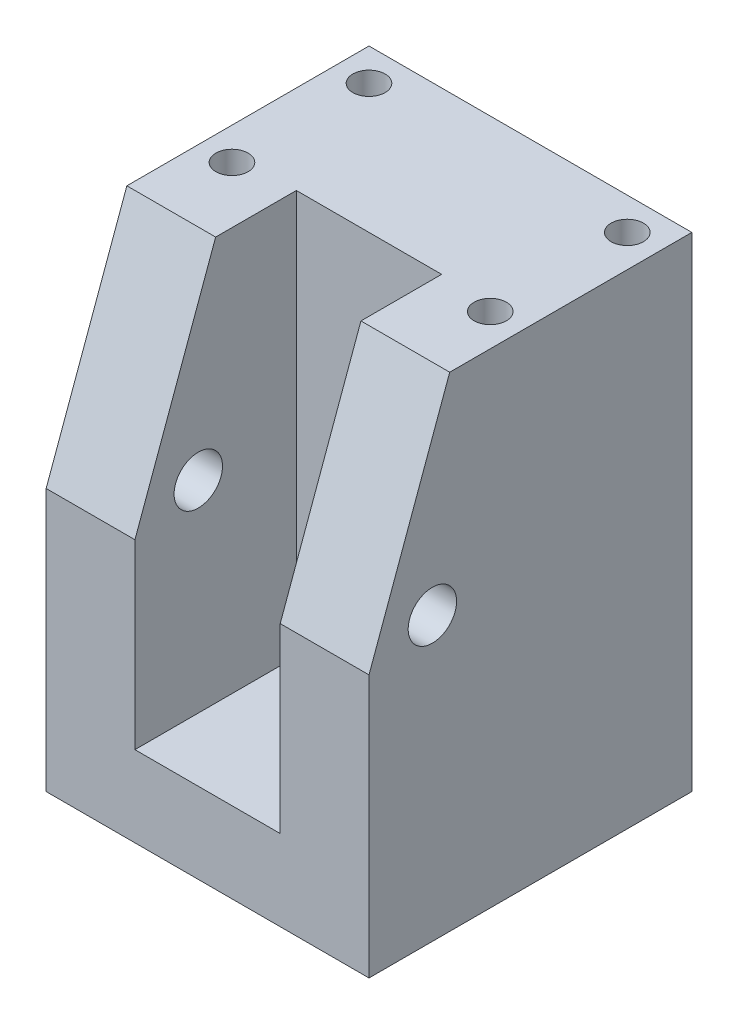
ISO-10303-21;
HEADER;
FILE_DESCRIPTION(('STEP AP214'),'2;1');
FILE_NAME('part.step','',(''),(''),'','','');
FILE_SCHEMA(('AUTOMOTIVE_DESIGN { 1 0 10303 214 1 1 1 1 }'));
ENDSEC;
DATA;
#1=APPLICATION_CONTEXT('core data for automotive mechanical design processes');
#2=APPLICATION_PROTOCOL_DEFINITION('international standard','automotive_design',2000,#1);
#3=PRODUCT_CONTEXT('',#1,'mechanical');
#4=PRODUCT('Part','Part','',(#3));
#5=PRODUCT_RELATED_PRODUCT_CATEGORY('part','',(#4));
#6=PRODUCT_DEFINITION_FORMATION('','',#4);
#7=PRODUCT_DEFINITION_CONTEXT('part definition',#1,'design');
#8=PRODUCT_DEFINITION('design','',#6,#7);
#9=PRODUCT_DEFINITION_SHAPE('','',#8);
#10=(LENGTH_UNIT() NAMED_UNIT(*) SI_UNIT(.MILLI.,.METRE.));
#11=(NAMED_UNIT(*) PLANE_ANGLE_UNIT() SI_UNIT($,.RADIAN.));
#12=(NAMED_UNIT(*) SI_UNIT($,.STERADIAN.) SOLID_ANGLE_UNIT());
#13=UNCERTAINTY_MEASURE_WITH_UNIT(LENGTH_MEASURE(1.E-05),#10,'distance_accuracy_value','');
#14=(GEOMETRIC_REPRESENTATION_CONTEXT(3) GLOBAL_UNCERTAINTY_ASSIGNED_CONTEXT((#13)) GLOBAL_UNIT_ASSIGNED_CONTEXT((#10,
#11,#12)) REPRESENTATION_CONTEXT('',''));
#15=CARTESIAN_POINT('',(0.,0.,0.));
#16=DIRECTION('',(0.,0.,1.));
#17=DIRECTION('',(1.,0.,0.));
#18=AXIS2_PLACEMENT_3D('',#15,#16,#17);
#19=CARTESIAN_POINT('',(0.,-60.,20.));
#20=DIRECTION('',(0.,0.,-1.));
#21=DIRECTION('',(-1.,0.,0.));
#22=AXIS2_PLACEMENT_3D('',#19,#20,#21);
#23=PLANE('',#22);
#24=DIRECTION('',(0.,1.,0.));
#25=VECTOR('',#24,1.);
#26=CARTESIAN_POINT('',(20.,-60.,20.));
#27=LINE('',#26,#25);
#28=CARTESIAN_POINT('',(20.,-60.,20.));
#29=VERTEX_POINT('',#28);
#30=CARTESIAN_POINT('',(20.,-27.4747741945462,20.));
#31=VERTEX_POINT('',#30);
#32=EDGE_CURVE('E174',#29,#31,#27,.T.);
#33=ORIENTED_EDGE('',*,*,#32,.T.);
#34=DIRECTION('',(-1.,0.,0.));
#35=VECTOR('',#34,1.);
#36=CARTESIAN_POINT('',(9.,-27.4747741945462,20.));
#37=LINE('',#36,#35);
#38=CARTESIAN_POINT('',(9.,-27.4747741945462,20.));
#39=VERTEX_POINT('',#38);
#40=EDGE_CURVE('E212',#31,#39,#37,.T.);
#41=ORIENTED_EDGE('',*,*,#40,.T.);
#42=DIRECTION('',(0.,1.,0.));
#43=VECTOR('',#42,1.);
#44=CARTESIAN_POINT('',(9.,-50.,20.));
#45=LINE('',#44,#43);
#46=CARTESIAN_POINT('',(9.,-50.,20.));
#47=VERTEX_POINT('',#46);
#48=EDGE_CURVE('E157',#47,#39,#45,.T.);
#49=ORIENTED_EDGE('',*,*,#48,.F.);
#50=DIRECTION('',(-1.,0.,0.));
#51=VECTOR('',#50,1.);
#52=CARTESIAN_POINT('',(0.,-50.,20.));
#53=LINE('',#52,#51);
#54=CARTESIAN_POINT('',(-9.,-50.,20.));
#55=VERTEX_POINT('',#54);
#56=EDGE_CURVE('E132',#47,#55,#53,.T.);
#57=ORIENTED_EDGE('',*,*,#56,.T.);
#58=DIRECTION('',(0.,1.,0.));
#59=VECTOR('',#58,1.);
#60=CARTESIAN_POINT('',(-9.,-50.,20.));
#61=LINE('',#60,#59);
#62=CARTESIAN_POINT('',(-9.,-27.4747741945462,20.));
#63=VERTEX_POINT('',#62);
#64=EDGE_CURVE('E160',#55,#63,#61,.T.);
#65=ORIENTED_EDGE('',*,*,#64,.T.);
#66=DIRECTION('',(-1.,0.,0.));
#67=VECTOR('',#66,1.);
#68=CARTESIAN_POINT('',(-20.,-27.4747741945462,20.));
#69=LINE('',#68,#67);
#70=CARTESIAN_POINT('',(-20.,-27.4747741945462,20.));
#71=VERTEX_POINT('',#70);
#72=EDGE_CURVE('E182',#63,#71,#69,.T.);
#73=ORIENTED_EDGE('',*,*,#72,.T.);
#74=DIRECTION('',(0.,1.,0.));
#75=VECTOR('',#74,1.);
#76=CARTESIAN_POINT('',(-20.,-60.,20.));
#77=LINE('',#76,#75);
#78=CARTESIAN_POINT('',(-20.,-60.,20.));
#79=VERTEX_POINT('',#78);
#80=EDGE_CURVE('E180',#79,#71,#77,.T.);
#81=ORIENTED_EDGE('',*,*,#80,.F.);
#82=DIRECTION('',(-1.,0.,0.));
#83=VECTOR('',#82,1.);
#84=CARTESIAN_POINT('',(0.,-60.,20.));
#85=LINE('',#84,#83);
#86=EDGE_CURVE('E164',#29,#79,#85,.T.);
#87=ORIENTED_EDGE('',*,*,#86,.F.);
#88=EDGE_LOOP('',(#33,#41,#49,#57,#65,#73,#81,#87));
#89=FACE_BOUND('',#88,.T.);
#90=ADVANCED_FACE('F42',(#89),#23,.F.);
#91=CARTESIAN_POINT('',(-20.,-60.,0.));
#92=DIRECTION('',(-1.,0.,0.));
#93=DIRECTION('',(0.,0.,1.));
#94=AXIS2_PLACEMENT_3D('',#91,#92,#93);
#95=PLANE('',#94);
#96=CARTESIAN_POINT('',(-20.,-25.,12.1487261445352));
#97=DIRECTION('',(-1.,0.,0.));
#98=DIRECTION('',(0.,0.,1.));
#99=AXIS2_PLACEMENT_3D('',#96,#97,#98);
#100=CIRCLE('',#99,3.);
#101=CARTESIAN_POINT('',(-20.,-25.,15.1487261445352));
#102=VERTEX_POINT('',#101);
#103=EDGE_CURVE('E194',#102,#102,#100,.F.);
#104=ORIENTED_EDGE('',*,*,#103,.T.);
#105=EDGE_LOOP('',(#104));
#106=FACE_BOUND('',#105,.T.);
#107=ORIENTED_EDGE('',*,*,#80,.T.);
#108=DIRECTION('',(0.,0.939692620785908,-0.342020143325669));
#109=VECTOR('',#108,1.);
#110=CARTESIAN_POINT('',(-20.,-49.7673952451366,28.1138505061911));
#111=LINE('',#110,#109);
#112=CARTESIAN_POINT('',(-20.,0.,9.99999999999999));
#113=VERTEX_POINT('',#112);
#114=EDGE_CURVE('E51',#71,#113,#111,.T.);
#115=ORIENTED_EDGE('',*,*,#114,.T.);
#116=DIRECTION('',(0.,0.,1.));
#117=VECTOR('',#116,1.);
#118=CARTESIAN_POINT('',(-20.,0.,0.));
#119=LINE('',#118,#117);
#120=CARTESIAN_POINT('',(-20.,0.,-20.));
#121=VERTEX_POINT('',#120);
#122=EDGE_CURVE('E167',#121,#113,#119,.T.);
#123=ORIENTED_EDGE('',*,*,#122,.F.);
#124=DIRECTION('',(0.,1.,0.));
#125=VECTOR('',#124,1.);
#126=CARTESIAN_POINT('',(-20.,-60.,-20.));
#127=LINE('',#126,#125);
#128=CARTESIAN_POINT('',(-20.,-60.,-20.));
#129=VERTEX_POINT('',#128);
#130=EDGE_CURVE('E183',#129,#121,#127,.T.);
#131=ORIENTED_EDGE('',*,*,#130,.F.);
#132=DIRECTION('',(0.,0.,1.));
#133=VECTOR('',#132,1.);
#134=CARTESIAN_POINT('',(-20.,-60.,0.));
#135=LINE('',#134,#133);
#136=EDGE_CURVE('E171',#129,#79,#135,.T.);
#137=ORIENTED_EDGE('',*,*,#136,.T.);
#138=EDGE_LOOP('',(#107,#115,#123,#131,#137));
#139=FACE_BOUND('',#138,.T.);
#140=ADVANCED_FACE('F246',(#106,#139),#95,.T.);
#141=CARTESIAN_POINT('',(0.,-60.,-20.));
#142=DIRECTION('',(0.,0.,1.));
#143=DIRECTION('',(1.,0.,0.));
#144=AXIS2_PLACEMENT_3D('',#141,#142,#143);
#145=PLANE('',#144);
#146=DIRECTION('',(1.,0.,0.));
#147=VECTOR('',#146,1.);
#148=CARTESIAN_POINT('',(0.,0.,-20.));
#149=LINE('',#148,#147);
#150=CARTESIAN_POINT('',(20.,0.,-20.));
#151=VERTEX_POINT('',#150);
#152=EDGE_CURVE('E177',#121,#151,#149,.T.);
#153=ORIENTED_EDGE('',*,*,#152,.T.);
#154=DIRECTION('',(0.,1.,0.));
#155=VECTOR('',#154,1.);
#156=CARTESIAN_POINT('',(20.,-60.,-20.));
#157=LINE('',#156,#155);
#158=CARTESIAN_POINT('',(20.,-60.,-20.));
#159=VERTEX_POINT('',#158);
#160=EDGE_CURVE('E185',#159,#151,#157,.T.);
#161=ORIENTED_EDGE('',*,*,#160,.F.);
#162=DIRECTION('',(1.,0.,0.));
#163=VECTOR('',#162,1.);
#164=CARTESIAN_POINT('',(0.,-60.,-20.));
#165=LINE('',#164,#163);
#166=EDGE_CURVE('E169',#129,#159,#165,.T.);
#167=ORIENTED_EDGE('',*,*,#166,.F.);
#168=ORIENTED_EDGE('',*,*,#130,.T.);
#169=EDGE_LOOP('',(#153,#161,#167,#168));
#170=FACE_BOUND('',#169,.T.);
#171=ADVANCED_FACE('F251',(#170),#145,.F.);
#172=CARTESIAN_POINT('',(20.,-60.,0.));
#173=DIRECTION('',(-1.,0.,0.));
#174=DIRECTION('',(0.,0.,1.));
#175=AXIS2_PLACEMENT_3D('',#172,#173,#174);
#176=PLANE('',#175);
#177=CARTESIAN_POINT('',(20.,-25.,12.1487261445352));
#178=DIRECTION('',(-1.,0.,0.));
#179=DIRECTION('',(0.,0.,1.));
#180=AXIS2_PLACEMENT_3D('',#177,#178,#179);
#181=CIRCLE('',#180,3.);
#182=CARTESIAN_POINT('',(20.,-25.,15.1487261445352));
#183=VERTEX_POINT('',#182);
#184=EDGE_CURVE('E310',#183,#183,#181,.F.);
#185=ORIENTED_EDGE('',*,*,#184,.F.);
#186=EDGE_LOOP('',(#185));
#187=FACE_BOUND('',#186,.T.);
#188=DIRECTION('',(0.,0.,1.));
#189=VECTOR('',#188,1.);
#190=CARTESIAN_POINT('',(20.,0.,0.));
#191=LINE('',#190,#189);
#192=CARTESIAN_POINT('',(20.,0.,9.99999999999997));
#193=VERTEX_POINT('',#192);
#194=EDGE_CURVE('E159',#151,#193,#191,.T.);
#195=ORIENTED_EDGE('',*,*,#194,.T.);
#196=DIRECTION('',(0.,-0.939692620785908,0.342020143325669));
#197=VECTOR('',#196,1.);
#198=CARTESIAN_POINT('',(20.,-27.4747741945462,20.));
#199=LINE('',#198,#197);
#200=EDGE_CURVE('E220',#193,#31,#199,.T.);
#201=ORIENTED_EDGE('',*,*,#200,.T.);
#202=ORIENTED_EDGE('',*,*,#32,.F.);
#203=DIRECTION('',(0.,0.,1.));
#204=VECTOR('',#203,1.);
#205=CARTESIAN_POINT('',(20.,-60.,0.));
#206=LINE('',#205,#204);
#207=EDGE_CURVE('E166',#159,#29,#206,.T.);
#208=ORIENTED_EDGE('',*,*,#207,.F.);
#209=ORIENTED_EDGE('',*,*,#160,.T.);
#210=EDGE_LOOP('',(#195,#201,#202,#208,#209));
#211=FACE_BOUND('',#210,.T.);
#212=ADVANCED_FACE('F224',(#187,#211),#176,.F.);
#213=CARTESIAN_POINT('',(0.,-60.,0.));
#214=DIRECTION('',(0.,1.,0.));
#215=DIRECTION('',(0.,0.,1.));
#216=AXIS2_PLACEMENT_3D('',#213,#214,#215);
#217=PLANE('',#216);
#218=CARTESIAN_POINT('',(-16.,-60.,0.977001598051438));
#219=DIRECTION('',(0.,1.,0.));
#220=DIRECTION('',(0.,0.,1.));
#221=AXIS2_PLACEMENT_3D('',#218,#219,#220);
#222=CIRCLE('',#221,2.);
#223=CARTESIAN_POINT('',(-16.,-60.,2.97700159805144));
#224=VERTEX_POINT('',#223);
#225=EDGE_CURVE('E150',#224,#224,#222,.F.);
#226=ORIENTED_EDGE('',*,*,#225,.F.);
#227=EDGE_LOOP('',(#226));
#228=FACE_BOUND('',#227,.T.);
#229=CARTESIAN_POINT('',(16.,-60.,0.977001598051438));
#230=DIRECTION('',(0.,1.,0.));
#231=DIRECTION('',(0.,0.,1.));
#232=AXIS2_PLACEMENT_3D('',#229,#230,#231);
#233=CIRCLE('',#232,2.);
#234=CARTESIAN_POINT('',(16.,-60.,2.97700159805144));
#235=VERTEX_POINT('',#234);
#236=EDGE_CURVE('E202',#235,#235,#233,.F.);
#237=ORIENTED_EDGE('',*,*,#236,.F.);
#238=EDGE_LOOP('',(#237));
#239=FACE_BOUND('',#238,.T.);
#240=CARTESIAN_POINT('',(16.,-60.,-16.));
#241=DIRECTION('',(0.,1.,0.));
#242=DIRECTION('',(0.,0.,1.));
#243=AXIS2_PLACEMENT_3D('',#240,#241,#242);
#244=CIRCLE('',#243,2.);
#245=CARTESIAN_POINT('',(16.,-60.,-14.));
#246=VERTEX_POINT('',#245);
#247=EDGE_CURVE('E198',#246,#246,#244,.F.);
#248=ORIENTED_EDGE('',*,*,#247,.F.);
#249=EDGE_LOOP('',(#248));
#250=FACE_BOUND('',#249,.T.);
#251=CARTESIAN_POINT('',(-16.,-60.,-16.));
#252=DIRECTION('',(0.,1.,0.));
#253=DIRECTION('',(0.,0.,1.));
#254=AXIS2_PLACEMENT_3D('',#251,#252,#253);
#255=CIRCLE('',#254,2.);
#256=CARTESIAN_POINT('',(-16.,-60.,-14.));
#257=VERTEX_POINT('',#256);
#258=EDGE_CURVE('E193',#257,#257,#255,.F.);
#259=ORIENTED_EDGE('',*,*,#258,.F.);
#260=EDGE_LOOP('',(#259));
#261=FACE_BOUND('',#260,.T.);
#262=ORIENTED_EDGE('',*,*,#86,.T.);
#263=ORIENTED_EDGE('',*,*,#136,.F.);
#264=ORIENTED_EDGE('',*,*,#166,.T.);
#265=ORIENTED_EDGE('',*,*,#207,.T.);
#266=EDGE_LOOP('',(#262,#263,#264,#265));
#267=FACE_BOUND('',#266,.T.);
#268=ADVANCED_FACE('F262',(#228,#239,#250,#261,#267),#217,.F.);
#269=CARTESIAN_POINT('',(0.,0.,0.));
#270=DIRECTION('',(0.,1.,0.));
#271=DIRECTION('',(0.,0.,1.));
#272=AXIS2_PLACEMENT_3D('',#269,#270,#271);
#273=PLANE('',#272);
#274=CARTESIAN_POINT('',(-16.,0.,0.977001598051438));
#275=DIRECTION('',(0.,1.,0.));
#276=DIRECTION('',(0.,0.,1.));
#277=AXIS2_PLACEMENT_3D('',#274,#275,#276);
#278=CIRCLE('',#277,2.);
#279=CARTESIAN_POINT('',(-16.,0.,2.97700159805144));
#280=VERTEX_POINT('',#279);
#281=EDGE_CURVE('E203',#280,#280,#278,.F.);
#282=ORIENTED_EDGE('',*,*,#281,.T.);
#283=EDGE_LOOP('',(#282));
#284=FACE_BOUND('',#283,.T.);
#285=CARTESIAN_POINT('',(16.,0.,0.977001598051438));
#286=DIRECTION('',(0.,1.,0.));
#287=DIRECTION('',(0.,0.,1.));
#288=AXIS2_PLACEMENT_3D('',#285,#286,#287);
#289=CIRCLE('',#288,2.);
#290=CARTESIAN_POINT('',(16.,0.,2.97700159805144));
#291=VERTEX_POINT('',#290);
#292=EDGE_CURVE('E199',#291,#291,#289,.F.);
#293=ORIENTED_EDGE('',*,*,#292,.T.);
#294=EDGE_LOOP('',(#293));
#295=FACE_BOUND('',#294,.T.);
#296=CARTESIAN_POINT('',(16.,0.,-16.));
#297=DIRECTION('',(0.,1.,0.));
#298=DIRECTION('',(0.,0.,1.));
#299=AXIS2_PLACEMENT_3D('',#296,#297,#298);
#300=CIRCLE('',#299,2.);
#301=CARTESIAN_POINT('',(16.,0.,-14.));
#302=VERTEX_POINT('',#301);
#303=EDGE_CURVE('E195',#302,#302,#300,.F.);
#304=ORIENTED_EDGE('',*,*,#303,.T.);
#305=EDGE_LOOP('',(#304));
#306=FACE_BOUND('',#305,.T.);
#307=CARTESIAN_POINT('',(-16.,0.,-16.));
#308=DIRECTION('',(0.,1.,0.));
#309=DIRECTION('',(0.,0.,1.));
#310=AXIS2_PLACEMENT_3D('',#307,#308,#309);
#311=CIRCLE('',#310,2.);
#312=CARTESIAN_POINT('',(-16.,0.,-14.));
#313=VERTEX_POINT('',#312);
#314=EDGE_CURVE('E190',#313,#313,#311,.F.);
#315=ORIENTED_EDGE('',*,*,#314,.T.);
#316=EDGE_LOOP('',(#315));
#317=FACE_BOUND('',#316,.T.);
#318=DIRECTION('',(0.,0.,-1.));
#319=VECTOR('',#318,1.);
#320=CARTESIAN_POINT('',(9.,0.,0.));
#321=LINE('',#320,#319);
#322=CARTESIAN_POINT('',(9.,0.,9.99999999999998));
#323=VERTEX_POINT('',#322);
#324=CARTESIAN_POINT('',(9.,0.,0.));
#325=VERTEX_POINT('',#324);
#326=EDGE_CURVE('E127',#323,#325,#321,.T.);
#327=ORIENTED_EDGE('',*,*,#326,.F.);
#328=DIRECTION('',(1.,0.,0.));
#329=VECTOR('',#328,1.);
#330=CARTESIAN_POINT('',(20.,0.,9.99999999999997));
#331=LINE('',#330,#329);
#332=EDGE_CURVE('E218',#323,#193,#331,.T.);
#333=ORIENTED_EDGE('',*,*,#332,.T.);
#334=ORIENTED_EDGE('',*,*,#194,.F.);
#335=ORIENTED_EDGE('',*,*,#152,.F.);
#336=ORIENTED_EDGE('',*,*,#122,.T.);
#337=DIRECTION('',(1.,0.,0.));
#338=VECTOR('',#337,1.);
#339=CARTESIAN_POINT('',(-9.00000000000001,0.,9.99999999999999));
#340=LINE('',#339,#338);
#341=CARTESIAN_POINT('',(-9.,0.,9.99999999999999));
#342=VERTEX_POINT('',#341);
#343=EDGE_CURVE('E58',#113,#342,#340,.T.);
#344=ORIENTED_EDGE('',*,*,#343,.T.);
#345=DIRECTION('',(0.,0.,-1.));
#346=VECTOR('',#345,1.);
#347=CARTESIAN_POINT('',(-9.,0.,0.));
#348=LINE('',#347,#346);
#349=CARTESIAN_POINT('',(-9.,0.,0.));
#350=VERTEX_POINT('',#349);
#351=EDGE_CURVE('E145',#342,#350,#348,.T.);
#352=ORIENTED_EDGE('',*,*,#351,.T.);
#353=DIRECTION('',(-1.,0.,0.));
#354=VECTOR('',#353,1.);
#355=CARTESIAN_POINT('',(0.,0.,0.));
#356=LINE('',#355,#354);
#357=EDGE_CURVE('E147',#325,#350,#356,.T.);
#358=ORIENTED_EDGE('',*,*,#357,.F.);
#359=EDGE_LOOP('',(#327,#333,#334,#335,#336,#344,#352,#358));
#360=FACE_BOUND('',#359,.T.);
#361=ADVANCED_FACE('F234',(#284,#295,#306,#317,#360),#273,.T.);
#362=CARTESIAN_POINT('',(9.,-50.,0.));
#363=DIRECTION('',(1.,0.,0.));
#364=DIRECTION('',(0.,0.,-1.));
#365=AXIS2_PLACEMENT_3D('',#362,#363,#364);
#366=PLANE('',#365);
#367=CARTESIAN_POINT('',(9.,-25.,12.1487261445352));
#368=DIRECTION('',(1.,0.,0.));
#369=DIRECTION('',(0.,0.,-1.));
#370=AXIS2_PLACEMENT_3D('',#367,#368,#369);
#371=CIRCLE('',#370,3.);
#372=CARTESIAN_POINT('',(9.,-25.,9.14872614453518));
#373=VERTEX_POINT('',#372);
#374=EDGE_CURVE('E209',#373,#373,#371,.F.);
#375=ORIENTED_EDGE('',*,*,#374,.F.);
#376=EDGE_LOOP('',(#375));
#377=FACE_BOUND('',#376,.T.);
#378=ORIENTED_EDGE('',*,*,#48,.T.);
#379=DIRECTION('',(0.,0.939692620785908,-0.342020143325669));
#380=VECTOR('',#379,1.);
#381=CARTESIAN_POINT('',(9.,-27.4747741945462,20.));
#382=LINE('',#381,#380);
#383=EDGE_CURVE('E215',#39,#323,#382,.T.);
#384=ORIENTED_EDGE('',*,*,#383,.T.);
#385=ORIENTED_EDGE('',*,*,#326,.T.);
#386=DIRECTION('',(0.,1.,0.));
#387=VECTOR('',#386,1.);
#388=CARTESIAN_POINT('',(9.,-50.,0.));
#389=LINE('',#388,#387);
#390=CARTESIAN_POINT('',(9.,-50.,0.));
#391=VERTEX_POINT('',#390);
#392=EDGE_CURVE('E119',#391,#325,#389,.T.);
#393=ORIENTED_EDGE('',*,*,#392,.F.);
#394=DIRECTION('',(0.,0.,-1.));
#395=VECTOR('',#394,1.);
#396=CARTESIAN_POINT('',(9.,-50.,0.));
#397=LINE('',#396,#395);
#398=EDGE_CURVE('E124',#47,#391,#397,.T.);
#399=ORIENTED_EDGE('',*,*,#398,.F.);
#400=EDGE_LOOP('',(#378,#384,#385,#393,#399));
#401=FACE_BOUND('',#400,.T.);
#402=ADVANCED_FACE('F122',(#377,#401),#366,.F.);
#403=CARTESIAN_POINT('',(-9.,-50.,0.));
#404=DIRECTION('',(1.,0.,0.));
#405=DIRECTION('',(0.,0.,-1.));
#406=AXIS2_PLACEMENT_3D('',#403,#404,#405);
#407=PLANE('',#406);
#408=CARTESIAN_POINT('',(-9.,-25.,12.1487261445352));
#409=DIRECTION('',(1.,0.,0.));
#410=DIRECTION('',(0.,0.,-1.));
#411=AXIS2_PLACEMENT_3D('',#408,#409,#410);
#412=CIRCLE('',#411,3.);
#413=CARTESIAN_POINT('',(-9.,-25.,9.14872614453518));
#414=VERTEX_POINT('',#413);
#415=EDGE_CURVE('E206',#414,#414,#412,.F.);
#416=ORIENTED_EDGE('',*,*,#415,.T.);
#417=EDGE_LOOP('',(#416));
#418=FACE_BOUND('',#417,.T.);
#419=ORIENTED_EDGE('',*,*,#351,.F.);
#420=DIRECTION('',(0.,-0.939692620785908,0.342020143325669));
#421=VECTOR('',#420,1.);
#422=CARTESIAN_POINT('',(-9.,-40.9371730295417,24.8999124577584));
#423=LINE('',#422,#421);
#424=EDGE_CURVE('E11',#342,#63,#423,.T.);
#425=ORIENTED_EDGE('',*,*,#424,.T.);
#426=ORIENTED_EDGE('',*,*,#64,.F.);
#427=DIRECTION('',(0.,0.,-1.));
#428=VECTOR('',#427,1.);
#429=CARTESIAN_POINT('',(-9.,-50.,0.));
#430=LINE('',#429,#428);
#431=CARTESIAN_POINT('',(-9.,-50.,0.));
#432=VERTEX_POINT('',#431);
#433=EDGE_CURVE('E141',#55,#432,#430,.T.);
#434=ORIENTED_EDGE('',*,*,#433,.T.);
#435=DIRECTION('',(0.,1.,0.));
#436=VECTOR('',#435,1.);
#437=CARTESIAN_POINT('',(-9.,-50.,0.));
#438=LINE('',#437,#436);
#439=EDGE_CURVE('E131',#432,#350,#438,.T.);
#440=ORIENTED_EDGE('',*,*,#439,.T.);
#441=EDGE_LOOP('',(#419,#425,#426,#434,#440));
#442=FACE_BOUND('',#441,.T.);
#443=ADVANCED_FACE('F237',(#418,#442),#407,.T.);
#444=CARTESIAN_POINT('',(0.,-50.,0.));
#445=DIRECTION('',(0.,0.,-1.));
#446=DIRECTION('',(-1.,0.,0.));
#447=AXIS2_PLACEMENT_3D('',#444,#445,#446);
#448=PLANE('',#447);
#449=ORIENTED_EDGE('',*,*,#357,.T.);
#450=ORIENTED_EDGE('',*,*,#439,.F.);
#451=DIRECTION('',(-1.,0.,0.));
#452=VECTOR('',#451,1.);
#453=CARTESIAN_POINT('',(0.,-50.,0.));
#454=LINE('',#453,#452);
#455=EDGE_CURVE('E136',#391,#432,#454,.T.);
#456=ORIENTED_EDGE('',*,*,#455,.F.);
#457=ORIENTED_EDGE('',*,*,#392,.T.);
#458=EDGE_LOOP('',(#449,#450,#456,#457));
#459=FACE_BOUND('',#458,.T.);
#460=ADVANCED_FACE('F137',(#459),#448,.F.);
#461=CARTESIAN_POINT('',(0.,-50.,0.));
#462=DIRECTION('',(0.,1.,0.));
#463=DIRECTION('',(0.,0.,1.));
#464=AXIS2_PLACEMENT_3D('',#461,#462,#463);
#465=PLANE('',#464);
#466=ORIENTED_EDGE('',*,*,#398,.T.);
#467=ORIENTED_EDGE('',*,*,#455,.T.);
#468=ORIENTED_EDGE('',*,*,#433,.F.);
#469=ORIENTED_EDGE('',*,*,#56,.F.);
#470=EDGE_LOOP('',(#466,#467,#468,#469));
#471=FACE_BOUND('',#470,.T.);
#472=ADVANCED_FACE('F143',(#471),#465,.T.);
#473=CARTESIAN_POINT('',(-16.,28.,-16.));
#474=DIRECTION('',(0.,-1.,0.));
#475=DIRECTION('',(0.,0.,-1.));
#476=AXIS2_PLACEMENT_3D('',#473,#474,#475);
#477=CYLINDRICAL_SURFACE('',#476,2.);
#478=ORIENTED_EDGE('',*,*,#314,.F.);
#479=EDGE_LOOP('',(#478));
#480=FACE_BOUND('',#479,.T.);
#481=ORIENTED_EDGE('',*,*,#258,.T.);
#482=EDGE_LOOP('',(#481));
#483=FACE_BOUND('',#482,.T.);
#484=ADVANCED_FACE('F283',(#480,#483),#477,.F.);
#485=CARTESIAN_POINT('',(16.,28.,-16.));
#486=DIRECTION('',(0.,-1.,0.));
#487=DIRECTION('',(0.,0.,-1.));
#488=AXIS2_PLACEMENT_3D('',#485,#486,#487);
#489=CYLINDRICAL_SURFACE('',#488,2.);
#490=ORIENTED_EDGE('',*,*,#303,.F.);
#491=EDGE_LOOP('',(#490));
#492=FACE_BOUND('',#491,.T.);
#493=ORIENTED_EDGE('',*,*,#247,.T.);
#494=EDGE_LOOP('',(#493));
#495=FACE_BOUND('',#494,.T.);
#496=ADVANCED_FACE('F286',(#492,#495),#489,.F.);
#497=CARTESIAN_POINT('',(16.,28.,0.977001598051438));
#498=DIRECTION('',(0.,-1.,0.));
#499=DIRECTION('',(0.,0.,-1.));
#500=AXIS2_PLACEMENT_3D('',#497,#498,#499);
#501=CYLINDRICAL_SURFACE('',#500,2.);
#502=ORIENTED_EDGE('',*,*,#292,.F.);
#503=EDGE_LOOP('',(#502));
#504=FACE_BOUND('',#503,.T.);
#505=ORIENTED_EDGE('',*,*,#236,.T.);
#506=EDGE_LOOP('',(#505));
#507=FACE_BOUND('',#506,.T.);
#508=ADVANCED_FACE('F292',(#504,#507),#501,.F.);
#509=CARTESIAN_POINT('',(-16.,28.,0.977001598051438));
#510=DIRECTION('',(0.,-1.,0.));
#511=DIRECTION('',(0.,0.,-1.));
#512=AXIS2_PLACEMENT_3D('',#509,#510,#511);
#513=CYLINDRICAL_SURFACE('',#512,2.);
#514=ORIENTED_EDGE('',*,*,#281,.F.);
#515=EDGE_LOOP('',(#514));
#516=FACE_BOUND('',#515,.T.);
#517=ORIENTED_EDGE('',*,*,#225,.T.);
#518=EDGE_LOOP('',(#517));
#519=FACE_BOUND('',#518,.T.);
#520=ADVANCED_FACE('F288',(#516,#519),#513,.F.);
#521=CARTESIAN_POINT('',(-48.,-25.,12.1487261445352));
#522=DIRECTION('',(1.,0.,0.));
#523=DIRECTION('',(0.,0.,-1.));
#524=AXIS2_PLACEMENT_3D('',#521,#522,#523);
#525=CYLINDRICAL_SURFACE('',#524,3.);
#526=ORIENTED_EDGE('',*,*,#103,.F.);
#527=EDGE_LOOP('',(#526));
#528=FACE_BOUND('',#527,.T.);
#529=ORIENTED_EDGE('',*,*,#415,.F.);
#530=EDGE_LOOP('',(#529));
#531=FACE_BOUND('',#530,.T.);
#532=ADVANCED_FACE('F291',(#528,#531),#525,.F.);
#533=ORIENTED_EDGE('',*,*,#374,.T.);
#534=EDGE_LOOP('',(#533));
#535=FACE_BOUND('',#534,.T.);
#536=ORIENTED_EDGE('',*,*,#184,.T.);
#537=EDGE_LOOP('',(#536));
#538=FACE_BOUND('',#537,.T.);
#539=ADVANCED_FACE('F244',(#535,#538),#525,.F.);
#540=CARTESIAN_POINT('',(0.,-27.4747741945462,20.));
#541=DIRECTION('',(0.,0.342020143325669,0.939692620785908));
#542=DIRECTION('',(1.,0.,0.));
#543=AXIS2_PLACEMENT_3D('',#540,#541,#542);
#544=PLANE('',#543);
#545=ORIENTED_EDGE('',*,*,#200,.F.);
#546=ORIENTED_EDGE('',*,*,#332,.F.);
#547=ORIENTED_EDGE('',*,*,#383,.F.);
#548=ORIENTED_EDGE('',*,*,#40,.F.);
#549=EDGE_LOOP('',(#545,#546,#547,#548));
#550=FACE_BOUND('',#549,.T.);
#551=ADVANCED_FACE('F233',(#550),#544,.T.);
#552=CARTESIAN_POINT('',(0.,-27.4747741945462,20.));
#553=DIRECTION('',(0.,0.342020143325669,0.939692620785908));
#554=DIRECTION('',(1.,0.,0.));
#555=AXIS2_PLACEMENT_3D('',#552,#553,#554);
#556=PLANE('',#555);
#557=ORIENTED_EDGE('',*,*,#424,.F.);
#558=ORIENTED_EDGE('',*,*,#343,.F.);
#559=ORIENTED_EDGE('',*,*,#114,.F.);
#560=ORIENTED_EDGE('',*,*,#72,.F.);
#561=EDGE_LOOP('',(#557,#558,#559,#560));
#562=FACE_BOUND('',#561,.T.);
#563=ADVANCED_FACE('F45',(#562),#556,.T.);
#564=CLOSED_SHELL('',(#90,#140,#171,#212,#268,#361,#402,#443,#460,#472,#484,#496,#508,#520,#532,
#539,#551,#563));
#565=MANIFOLD_SOLID_BREP('B2',#564);
#566=ADVANCED_BREP_SHAPE_REPRESENTATION('',(#18,#565),#14);
#567=SHAPE_DEFINITION_REPRESENTATION(#9,#566);
ENDSEC;
END-ISO-10303-21;
